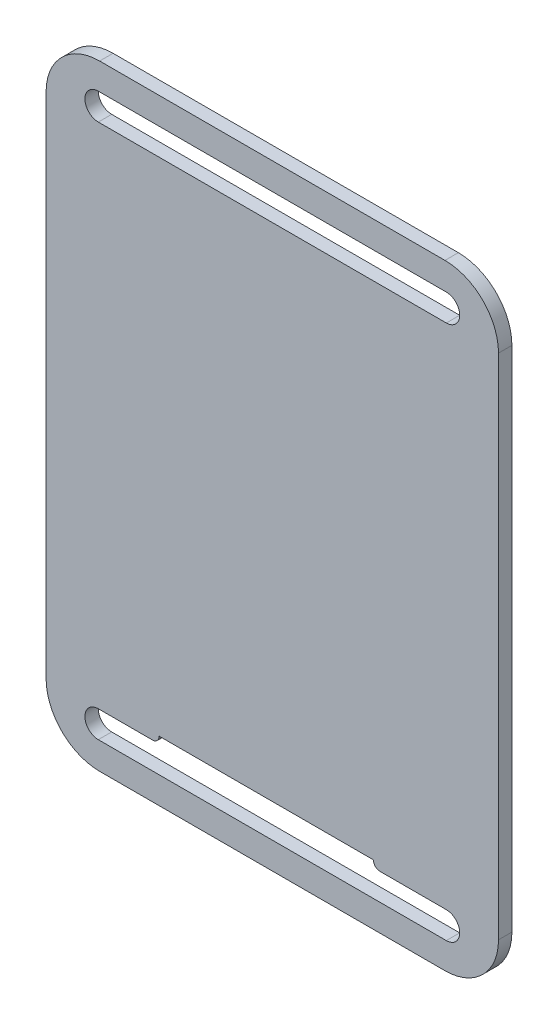
ISO-10303-21;
HEADER;
FILE_DESCRIPTION(('STEP AP214'),'2;1');
FILE_NAME('part.step','',(''),(''),'','','');
FILE_SCHEMA(('AUTOMOTIVE_DESIGN { 1 0 10303 214 1 1 1 1 }'));
ENDSEC;
DATA;
#1=APPLICATION_CONTEXT('core data for automotive mechanical design processes');
#2=APPLICATION_PROTOCOL_DEFINITION('international standard','automotive_design',2000,#1);
#3=PRODUCT_CONTEXT('',#1,'mechanical');
#4=PRODUCT('Part','Part','',(#3));
#5=PRODUCT_RELATED_PRODUCT_CATEGORY('part','',(#4));
#6=PRODUCT_DEFINITION_FORMATION('','',#4);
#7=PRODUCT_DEFINITION_CONTEXT('part definition',#1,'design');
#8=PRODUCT_DEFINITION('design','',#6,#7);
#9=PRODUCT_DEFINITION_SHAPE('','',#8);
#10=(LENGTH_UNIT() NAMED_UNIT(*) SI_UNIT(.MILLI.,.METRE.));
#11=(NAMED_UNIT(*) PLANE_ANGLE_UNIT() SI_UNIT($,.RADIAN.));
#12=(NAMED_UNIT(*) SI_UNIT($,.STERADIAN.) SOLID_ANGLE_UNIT());
#13=UNCERTAINTY_MEASURE_WITH_UNIT(LENGTH_MEASURE(1.E-05),#10,'distance_accuracy_value','');
#14=(GEOMETRIC_REPRESENTATION_CONTEXT(3) GLOBAL_UNCERTAINTY_ASSIGNED_CONTEXT((#13)) GLOBAL_UNIT_ASSIGNED_CONTEXT((#10,
#11,#12)) REPRESENTATION_CONTEXT('',''));
#15=CARTESIAN_POINT('',(0.,0.,0.));
#16=DIRECTION('',(0.,0.,1.));
#17=DIRECTION('',(1.,0.,0.));
#18=AXIS2_PLACEMENT_3D('',#15,#16,#17);
#19=CARTESIAN_POINT('',(4.,41.96,1.6));
#20=DIRECTION('',(0.,0.,-1.));
#21=DIRECTION('',(-1.,0.,0.));
#22=AXIS2_PLACEMENT_3D('',#19,#20,#21);
#23=CYLINDRICAL_SURFACE('',#22,4.);
#24=CARTESIAN_POINT('',(4.,41.96,0.6));
#25=DIRECTION('',(0.,0.,-1.));
#26=DIRECTION('',(-1.,0.,0.));
#27=AXIS2_PLACEMENT_3D('',#24,#25,#26);
#28=CIRCLE('',#27,4.);
#29=CARTESIAN_POINT('',(0.,41.96,0.6));
#30=VERTEX_POINT('',#29);
#31=CARTESIAN_POINT('',(4.,45.96,0.6));
#32=VERTEX_POINT('',#31);
#33=EDGE_CURVE('E292',#30,#32,#28,.T.);
#34=ORIENTED_EDGE('',*,*,#33,.F.);
#35=DIRECTION('',(0.,0.,-1.));
#36=VECTOR('',#35,1.);
#37=CARTESIAN_POINT('',(0.,41.96,1.6));
#38=LINE('',#37,#36);
#39=CARTESIAN_POINT('',(0.,41.96,1.6));
#40=VERTEX_POINT('',#39);
#41=EDGE_CURVE('E11',#40,#30,#38,.T.);
#42=ORIENTED_EDGE('',*,*,#41,.F.);
#43=CARTESIAN_POINT('',(4.,41.96,1.6));
#44=DIRECTION('',(0.,0.,-1.));
#45=DIRECTION('',(-1.,0.,0.));
#46=AXIS2_PLACEMENT_3D('',#43,#44,#45);
#47=CIRCLE('',#46,4.);
#48=CARTESIAN_POINT('',(4.,45.96,1.6));
#49=VERTEX_POINT('',#48);
#50=EDGE_CURVE('E314',#40,#49,#47,.T.);
#51=ORIENTED_EDGE('',*,*,#50,.T.);
#52=DIRECTION('',(0.,0.,-1.));
#53=VECTOR('',#52,1.);
#54=CARTESIAN_POINT('',(4.,45.96,1.6));
#55=LINE('',#54,#53);
#56=EDGE_CURVE('E42',#49,#32,#55,.T.);
#57=ORIENTED_EDGE('',*,*,#56,.T.);
#58=EDGE_LOOP('',(#34,#42,#51,#57));
#59=FACE_BOUND('',#58,.T.);
#60=ADVANCED_FACE('F39',(#59),#23,.T.);
#61=CARTESIAN_POINT('',(0.,4.,1.6));
#62=DIRECTION('',(-1.,0.,0.));
#63=DIRECTION('',(0.,0.,1.));
#64=AXIS2_PLACEMENT_3D('',#61,#62,#63);
#65=PLANE('',#64);
#66=DIRECTION('',(0.,1.,0.));
#67=VECTOR('',#66,1.);
#68=CARTESIAN_POINT('',(0.,4.,0.6));
#69=LINE('',#68,#67);
#70=CARTESIAN_POINT('',(0.,4.,0.6));
#71=VERTEX_POINT('',#70);
#72=EDGE_CURVE('E319',#71,#30,#69,.T.);
#73=ORIENTED_EDGE('',*,*,#72,.F.);
#74=DIRECTION('',(0.,0.,-1.));
#75=VECTOR('',#74,1.);
#76=CARTESIAN_POINT('',(0.,4.,1.6));
#77=LINE('',#76,#75);
#78=CARTESIAN_POINT('',(0.,4.,1.6));
#79=VERTEX_POINT('',#78);
#80=EDGE_CURVE('E48',#79,#71,#77,.T.);
#81=ORIENTED_EDGE('',*,*,#80,.F.);
#82=DIRECTION('',(0.,1.,0.));
#83=VECTOR('',#82,1.);
#84=CARTESIAN_POINT('',(0.,4.,1.6));
#85=LINE('',#84,#83);
#86=EDGE_CURVE('E343',#79,#40,#85,.T.);
#87=ORIENTED_EDGE('',*,*,#86,.T.);
#88=ORIENTED_EDGE('',*,*,#41,.T.);
#89=EDGE_LOOP('',(#73,#81,#87,#88));
#90=FACE_BOUND('',#89,.T.);
#91=ADVANCED_FACE('F406',(#90),#65,.T.);
#92=CARTESIAN_POINT('',(4.,4.,1.6));
#93=DIRECTION('',(0.,0.,-1.));
#94=DIRECTION('',(-1.,0.,0.));
#95=AXIS2_PLACEMENT_3D('',#92,#93,#94);
#96=CYLINDRICAL_SURFACE('',#95,4.);
#97=CARTESIAN_POINT('',(4.,4.,0.6));
#98=DIRECTION('',(0.,0.,-1.));
#99=DIRECTION('',(-1.,0.,0.));
#100=AXIS2_PLACEMENT_3D('',#97,#98,#99);
#101=CIRCLE('',#100,4.);
#102=CARTESIAN_POINT('',(4.,0.,0.6));
#103=VERTEX_POINT('',#102);
#104=EDGE_CURVE('E370',#103,#71,#101,.T.);
#105=ORIENTED_EDGE('',*,*,#104,.F.);
#106=DIRECTION('',(0.,0.,-1.));
#107=VECTOR('',#106,1.);
#108=CARTESIAN_POINT('',(4.,0.,1.6));
#109=LINE('',#108,#107);
#110=CARTESIAN_POINT('',(4.,0.,1.6));
#111=VERTEX_POINT('',#110);
#112=EDGE_CURVE('E379',#111,#103,#109,.T.);
#113=ORIENTED_EDGE('',*,*,#112,.F.);
#114=CARTESIAN_POINT('',(4.,4.,1.6));
#115=DIRECTION('',(0.,0.,-1.));
#116=DIRECTION('',(-1.,0.,0.));
#117=AXIS2_PLACEMENT_3D('',#114,#115,#116);
#118=CIRCLE('',#117,4.);
#119=EDGE_CURVE('E339',#111,#79,#118,.T.);
#120=ORIENTED_EDGE('',*,*,#119,.T.);
#121=ORIENTED_EDGE('',*,*,#80,.T.);
#122=EDGE_LOOP('',(#105,#113,#120,#121));
#123=FACE_BOUND('',#122,.T.);
#124=ADVANCED_FACE('F426',(#123),#96,.T.);
#125=CARTESIAN_POINT('',(29.8,0.,1.6));
#126=DIRECTION('',(0.,-1.,0.));
#127=DIRECTION('',(0.,0.,-1.));
#128=AXIS2_PLACEMENT_3D('',#125,#126,#127);
#129=PLANE('',#128);
#130=DIRECTION('',(-1.,0.,0.));
#131=VECTOR('',#130,1.);
#132=CARTESIAN_POINT('',(29.8,0.,0.6));
#133=LINE('',#132,#131);
#134=CARTESIAN_POINT('',(29.8,0.,0.6));
#135=VERTEX_POINT('',#134);
#136=EDGE_CURVE('E366',#135,#103,#133,.T.);
#137=ORIENTED_EDGE('',*,*,#136,.F.);
#138=DIRECTION('',(0.,0.,-1.));
#139=VECTOR('',#138,1.);
#140=CARTESIAN_POINT('',(29.8,0.,1.6));
#141=LINE('',#140,#139);
#142=CARTESIAN_POINT('',(29.8,0.,1.6));
#143=VERTEX_POINT('',#142);
#144=EDGE_CURVE('E382',#143,#135,#141,.T.);
#145=ORIENTED_EDGE('',*,*,#144,.F.);
#146=DIRECTION('',(-1.,0.,0.));
#147=VECTOR('',#146,1.);
#148=CARTESIAN_POINT('',(29.8,0.,1.6));
#149=LINE('',#148,#147);
#150=EDGE_CURVE('E335',#143,#111,#149,.T.);
#151=ORIENTED_EDGE('',*,*,#150,.T.);
#152=ORIENTED_EDGE('',*,*,#112,.T.);
#153=EDGE_LOOP('',(#137,#145,#151,#152));
#154=FACE_BOUND('',#153,.T.);
#155=ADVANCED_FACE('F424',(#154),#129,.T.);
#156=CARTESIAN_POINT('',(29.8,4.,1.6));
#157=DIRECTION('',(0.,0.,-1.));
#158=DIRECTION('',(-1.,0.,0.));
#159=AXIS2_PLACEMENT_3D('',#156,#157,#158);
#160=CYLINDRICAL_SURFACE('',#159,4.);
#161=CARTESIAN_POINT('',(29.8,4.,0.6));
#162=DIRECTION('',(0.,0.,-1.));
#163=DIRECTION('',(-1.,0.,0.));
#164=AXIS2_PLACEMENT_3D('',#161,#162,#163);
#165=CIRCLE('',#164,4.);
#166=CARTESIAN_POINT('',(33.8,4.,0.6));
#167=VERTEX_POINT('',#166);
#168=EDGE_CURVE('E362',#167,#135,#165,.T.);
#169=ORIENTED_EDGE('',*,*,#168,.F.);
#170=DIRECTION('',(0.,0.,-1.));
#171=VECTOR('',#170,1.);
#172=CARTESIAN_POINT('',(33.8,4.,1.6));
#173=LINE('',#172,#171);
#174=CARTESIAN_POINT('',(33.8,4.,1.6));
#175=VERTEX_POINT('',#174);
#176=EDGE_CURVE('E385',#175,#167,#173,.T.);
#177=ORIENTED_EDGE('',*,*,#176,.F.);
#178=CARTESIAN_POINT('',(29.8,4.,1.6));
#179=DIRECTION('',(0.,0.,-1.));
#180=DIRECTION('',(-1.,0.,0.));
#181=AXIS2_PLACEMENT_3D('',#178,#179,#180);
#182=CIRCLE('',#181,4.);
#183=EDGE_CURVE('E331',#175,#143,#182,.T.);
#184=ORIENTED_EDGE('',*,*,#183,.T.);
#185=ORIENTED_EDGE('',*,*,#144,.T.);
#186=EDGE_LOOP('',(#169,#177,#184,#185));
#187=FACE_BOUND('',#186,.T.);
#188=ADVANCED_FACE('F420',(#187),#160,.T.);
#189=CARTESIAN_POINT('',(33.8,41.96,1.6));
#190=DIRECTION('',(1.,0.,0.));
#191=DIRECTION('',(0.,0.,-1.));
#192=AXIS2_PLACEMENT_3D('',#189,#190,#191);
#193=PLANE('',#192);
#194=DIRECTION('',(0.,-1.,0.));
#195=VECTOR('',#194,1.);
#196=CARTESIAN_POINT('',(33.8,41.96,0.6));
#197=LINE('',#196,#195);
#198=CARTESIAN_POINT('',(33.8,41.96,0.6));
#199=VERTEX_POINT('',#198);
#200=EDGE_CURVE('E358',#199,#167,#197,.T.);
#201=ORIENTED_EDGE('',*,*,#200,.F.);
#202=DIRECTION('',(0.,0.,-1.));
#203=VECTOR('',#202,1.);
#204=CARTESIAN_POINT('',(33.8,41.96,1.6));
#205=LINE('',#204,#203);
#206=CARTESIAN_POINT('',(33.8,41.96,1.6));
#207=VERTEX_POINT('',#206);
#208=EDGE_CURVE('E388',#207,#199,#205,.T.);
#209=ORIENTED_EDGE('',*,*,#208,.F.);
#210=DIRECTION('',(0.,-1.,0.));
#211=VECTOR('',#210,1.);
#212=CARTESIAN_POINT('',(33.8,41.96,1.6));
#213=LINE('',#212,#211);
#214=EDGE_CURVE('E327',#207,#175,#213,.T.);
#215=ORIENTED_EDGE('',*,*,#214,.T.);
#216=ORIENTED_EDGE('',*,*,#176,.T.);
#217=EDGE_LOOP('',(#201,#209,#215,#216));
#218=FACE_BOUND('',#217,.T.);
#219=ADVANCED_FACE('F418',(#218),#193,.T.);
#220=CARTESIAN_POINT('',(29.8,41.96,1.6));
#221=DIRECTION('',(0.,0.,-1.));
#222=DIRECTION('',(-1.,0.,0.));
#223=AXIS2_PLACEMENT_3D('',#220,#221,#222);
#224=CYLINDRICAL_SURFACE('',#223,4.);
#225=CARTESIAN_POINT('',(29.8,41.96,0.6));
#226=DIRECTION('',(0.,0.,-1.));
#227=DIRECTION('',(-1.,0.,0.));
#228=AXIS2_PLACEMENT_3D('',#225,#226,#227);
#229=CIRCLE('',#228,4.);
#230=CARTESIAN_POINT('',(29.8,45.96,0.6));
#231=VERTEX_POINT('',#230);
#232=EDGE_CURVE('E354',#231,#199,#229,.T.);
#233=ORIENTED_EDGE('',*,*,#232,.F.);
#234=DIRECTION('',(0.,0.,-1.));
#235=VECTOR('',#234,1.);
#236=CARTESIAN_POINT('',(29.8,45.96,1.6));
#237=LINE('',#236,#235);
#238=CARTESIAN_POINT('',(29.8,45.96,1.6));
#239=VERTEX_POINT('',#238);
#240=EDGE_CURVE('E390',#239,#231,#237,.T.);
#241=ORIENTED_EDGE('',*,*,#240,.F.);
#242=CARTESIAN_POINT('',(29.8,41.96,1.6));
#243=DIRECTION('',(0.,0.,-1.));
#244=DIRECTION('',(-1.,0.,0.));
#245=AXIS2_PLACEMENT_3D('',#242,#243,#244);
#246=CIRCLE('',#245,4.);
#247=EDGE_CURVE('E323',#239,#207,#246,.T.);
#248=ORIENTED_EDGE('',*,*,#247,.T.);
#249=ORIENTED_EDGE('',*,*,#208,.T.);
#250=EDGE_LOOP('',(#233,#241,#248,#249));
#251=FACE_BOUND('',#250,.T.);
#252=ADVANCED_FACE('F414',(#251),#224,.T.);
#253=CARTESIAN_POINT('',(4.,45.96,1.6));
#254=DIRECTION('',(0.,1.,0.));
#255=DIRECTION('',(0.,0.,1.));
#256=AXIS2_PLACEMENT_3D('',#253,#254,#255);
#257=PLANE('',#256);
#258=DIRECTION('',(1.,0.,0.));
#259=VECTOR('',#258,1.);
#260=CARTESIAN_POINT('',(4.,45.96,0.6));
#261=LINE('',#260,#259);
#262=EDGE_CURVE('E350',#32,#231,#261,.T.);
#263=ORIENTED_EDGE('',*,*,#262,.F.);
#264=ORIENTED_EDGE('',*,*,#56,.F.);
#265=DIRECTION('',(1.,0.,0.));
#266=VECTOR('',#265,1.);
#267=CARTESIAN_POINT('',(4.,45.96,1.6));
#268=LINE('',#267,#266);
#269=EDGE_CURVE('E318',#49,#239,#268,.T.);
#270=ORIENTED_EDGE('',*,*,#269,.T.);
#271=ORIENTED_EDGE('',*,*,#240,.T.);
#272=EDGE_LOOP('',(#263,#264,#270,#271));
#273=FACE_BOUND('',#272,.T.);
#274=ADVANCED_FACE('F400',(#273),#257,.T.);
#275=CARTESIAN_POINT('',(4.,41.96,1.6));
#276=DIRECTION('',(0.,0.,-1.));
#277=DIRECTION('',(-1.,0.,0.));
#278=AXIS2_PLACEMENT_3D('',#275,#276,#277);
#279=PLANE('',#278);
#280=DIRECTION('',(-1.,0.,0.));
#281=VECTOR('',#280,1.);
#282=CARTESIAN_POINT('',(3.9,41.96,1.6));
#283=LINE('',#282,#281);
#284=CARTESIAN_POINT('',(29.9,41.96,1.6));
#285=VERTEX_POINT('',#284);
#286=CARTESIAN_POINT('',(3.9,41.96,1.6));
#287=VERTEX_POINT('',#286);
#288=EDGE_CURVE('E186',#285,#287,#283,.T.);
#289=ORIENTED_EDGE('',*,*,#288,.T.);
#290=CARTESIAN_POINT('',(3.9,42.96,1.6));
#291=DIRECTION('',(0.,0.,-1.));
#292=DIRECTION('',(1.,0.,0.));
#293=AXIS2_PLACEMENT_3D('',#290,#291,#292);
#294=CIRCLE('',#293,1.);
#295=CARTESIAN_POINT('',(3.9,43.96,1.6));
#296=VERTEX_POINT('',#295);
#297=EDGE_CURVE('E179',#287,#296,#294,.T.);
#298=ORIENTED_EDGE('',*,*,#297,.T.);
#299=DIRECTION('',(1.,0.,0.));
#300=VECTOR('',#299,1.);
#301=CARTESIAN_POINT('',(29.9,43.96,1.6));
#302=LINE('',#301,#300);
#303=CARTESIAN_POINT('',(29.9,43.96,1.6));
#304=VERTEX_POINT('',#303);
#305=EDGE_CURVE('E189',#296,#304,#302,.T.);
#306=ORIENTED_EDGE('',*,*,#305,.T.);
#307=CARTESIAN_POINT('',(29.9,42.96,1.6));
#308=DIRECTION('',(0.,0.,-1.));
#309=DIRECTION('',(1.,0.,0.));
#310=AXIS2_PLACEMENT_3D('',#307,#308,#309);
#311=CIRCLE('',#310,1.);
#312=EDGE_CURVE('E56',#304,#285,#311,.T.);
#313=ORIENTED_EDGE('',*,*,#312,.T.);
#314=EDGE_LOOP('',(#289,#298,#306,#313));
#315=FACE_BOUND('',#314,.T.);
#316=DIRECTION('',(1.,0.,0.));
#317=VECTOR('',#316,1.);
#318=CARTESIAN_POINT('',(7.95,4.,1.6));
#319=LINE('',#318,#317);
#320=CARTESIAN_POINT('',(3.9,4.,1.6));
#321=VERTEX_POINT('',#320);
#322=CARTESIAN_POINT('',(7.95,4.,1.6));
#323=VERTEX_POINT('',#322);
#324=EDGE_CURVE('E255',#321,#323,#319,.T.);
#325=ORIENTED_EDGE('',*,*,#324,.T.);
#326=CARTESIAN_POINT('',(7.95,4.5,1.6));
#327=DIRECTION('',(0.,0.,1.));
#328=DIRECTION('',(-1.,0.,0.));
#329=AXIS2_PLACEMENT_3D('',#326,#327,#328);
#330=CIRCLE('',#329,0.5);
#331=CARTESIAN_POINT('',(8.45,4.5,1.6));
#332=VERTEX_POINT('',#331);
#333=EDGE_CURVE('E226',#323,#332,#330,.T.);
#334=ORIENTED_EDGE('',*,*,#333,.T.);
#335=DIRECTION('',(1.,0.,0.));
#336=VECTOR('',#335,1.);
#337=CARTESIAN_POINT('',(24.45,4.5,1.6));
#338=LINE('',#337,#336);
#339=CARTESIAN_POINT('',(24.45,4.5,1.6));
#340=VERTEX_POINT('',#339);
#341=EDGE_CURVE('E230',#332,#340,#338,.T.);
#342=ORIENTED_EDGE('',*,*,#341,.T.);
#343=CARTESIAN_POINT('',(24.95,4.5,1.6));
#344=DIRECTION('',(0.,0.,1.));
#345=DIRECTION('',(-1.,0.,0.));
#346=AXIS2_PLACEMENT_3D('',#343,#344,#345);
#347=CIRCLE('',#346,0.500000000000001);
#348=CARTESIAN_POINT('',(24.95,4.,1.6));
#349=VERTEX_POINT('',#348);
#350=EDGE_CURVE('E235',#340,#349,#347,.T.);
#351=ORIENTED_EDGE('',*,*,#350,.T.);
#352=DIRECTION('',(1.,0.,0.));
#353=VECTOR('',#352,1.);
#354=CARTESIAN_POINT('',(29.9,4.,1.6));
#355=LINE('',#354,#353);
#356=CARTESIAN_POINT('',(29.9,4.,1.6));
#357=VERTEX_POINT('',#356);
#358=EDGE_CURVE('E239',#349,#357,#355,.T.);
#359=ORIENTED_EDGE('',*,*,#358,.T.);
#360=CARTESIAN_POINT('',(29.9,3.,1.6));
#361=DIRECTION('',(0.,0.,-1.));
#362=DIRECTION('',(1.,0.,0.));
#363=AXIS2_PLACEMENT_3D('',#360,#361,#362);
#364=CIRCLE('',#363,1.);
#365=CARTESIAN_POINT('',(29.9,2.,1.6));
#366=VERTEX_POINT('',#365);
#367=EDGE_CURVE('E243',#357,#366,#364,.T.);
#368=ORIENTED_EDGE('',*,*,#367,.T.);
#369=DIRECTION('',(-1.,0.,0.));
#370=VECTOR('',#369,1.);
#371=CARTESIAN_POINT('',(3.9,2.,1.6));
#372=LINE('',#371,#370);
#373=CARTESIAN_POINT('',(3.9,2.,1.6));
#374=VERTEX_POINT('',#373);
#375=EDGE_CURVE('E247',#366,#374,#372,.T.);
#376=ORIENTED_EDGE('',*,*,#375,.T.);
#377=CARTESIAN_POINT('',(3.9,3.,1.6));
#378=DIRECTION('',(0.,0.,-1.));
#379=DIRECTION('',(1.,0.,0.));
#380=AXIS2_PLACEMENT_3D('',#377,#378,#379);
#381=CIRCLE('',#380,1.);
#382=EDGE_CURVE('E251',#374,#321,#381,.T.);
#383=ORIENTED_EDGE('',*,*,#382,.T.);
#384=EDGE_LOOP('',(#325,#334,#342,#351,#359,#368,#376,#383));
#385=FACE_BOUND('',#384,.T.);
#386=ORIENTED_EDGE('',*,*,#50,.F.);
#387=ORIENTED_EDGE('',*,*,#86,.F.);
#388=ORIENTED_EDGE('',*,*,#119,.F.);
#389=ORIENTED_EDGE('',*,*,#150,.F.);
#390=ORIENTED_EDGE('',*,*,#183,.F.);
#391=ORIENTED_EDGE('',*,*,#214,.F.);
#392=ORIENTED_EDGE('',*,*,#247,.F.);
#393=ORIENTED_EDGE('',*,*,#269,.F.);
#394=EDGE_LOOP('',(#386,#387,#388,#389,#390,#391,#392,#393));
#395=FACE_BOUND('',#394,.T.);
#396=ADVANCED_FACE('F194',(#315,#385,#395),#279,.F.);
#397=CARTESIAN_POINT('',(4.,41.96,0.6));
#398=DIRECTION('',(0.,0.,-1.));
#399=DIRECTION('',(-1.,0.,0.));
#400=AXIS2_PLACEMENT_3D('',#397,#398,#399);
#401=PLANE('',#400);
#402=CARTESIAN_POINT('',(3.9,42.96,0.6));
#403=DIRECTION('',(0.,0.,-1.));
#404=DIRECTION('',(1.,0.,0.));
#405=AXIS2_PLACEMENT_3D('',#402,#403,#404);
#406=CIRCLE('',#405,1.);
#407=CARTESIAN_POINT('',(3.9,41.96,0.6));
#408=VERTEX_POINT('',#407);
#409=CARTESIAN_POINT('',(3.9,43.96,0.6));
#410=VERTEX_POINT('',#409);
#411=EDGE_CURVE('E64',#408,#410,#406,.T.);
#412=ORIENTED_EDGE('',*,*,#411,.F.);
#413=DIRECTION('',(-1.,0.,0.));
#414=VECTOR('',#413,1.);
#415=CARTESIAN_POINT('',(3.9,41.96,0.6));
#416=LINE('',#415,#414);
#417=CARTESIAN_POINT('',(29.9,41.96,0.6));
#418=VERTEX_POINT('',#417);
#419=EDGE_CURVE('E198',#418,#408,#416,.T.);
#420=ORIENTED_EDGE('',*,*,#419,.F.);
#421=CARTESIAN_POINT('',(29.9,42.96,0.6));
#422=DIRECTION('',(0.,0.,-1.));
#423=DIRECTION('',(1.,0.,0.));
#424=AXIS2_PLACEMENT_3D('',#421,#422,#423);
#425=CIRCLE('',#424,1.);
#426=CARTESIAN_POINT('',(29.9,43.96,0.6));
#427=VERTEX_POINT('',#426);
#428=EDGE_CURVE('E202',#427,#418,#425,.T.);
#429=ORIENTED_EDGE('',*,*,#428,.F.);
#430=DIRECTION('',(1.,0.,0.));
#431=VECTOR('',#430,1.);
#432=CARTESIAN_POINT('',(29.9,43.96,0.6));
#433=LINE('',#432,#431);
#434=EDGE_CURVE('E211',#410,#427,#433,.T.);
#435=ORIENTED_EDGE('',*,*,#434,.F.);
#436=EDGE_LOOP('',(#412,#420,#429,#435));
#437=FACE_BOUND('',#436,.T.);
#438=CARTESIAN_POINT('',(7.95,4.5,0.6));
#439=DIRECTION('',(0.,0.,1.));
#440=DIRECTION('',(-1.,0.,0.));
#441=AXIS2_PLACEMENT_3D('',#438,#439,#440);
#442=CIRCLE('',#441,0.5);
#443=CARTESIAN_POINT('',(7.95,4.,0.6));
#444=VERTEX_POINT('',#443);
#445=CARTESIAN_POINT('',(8.45,4.5,0.6));
#446=VERTEX_POINT('',#445);
#447=EDGE_CURVE('E220',#444,#446,#442,.T.);
#448=ORIENTED_EDGE('',*,*,#447,.F.);
#449=DIRECTION('',(1.,0.,0.));
#450=VECTOR('',#449,1.);
#451=CARTESIAN_POINT('',(7.95,4.,0.6));
#452=LINE('',#451,#450);
#453=CARTESIAN_POINT('',(3.9,4.,0.6));
#454=VERTEX_POINT('',#453);
#455=EDGE_CURVE('E231',#454,#444,#452,.T.);
#456=ORIENTED_EDGE('',*,*,#455,.F.);
#457=CARTESIAN_POINT('',(3.9,3.,0.6));
#458=DIRECTION('',(0.,0.,-1.));
#459=DIRECTION('',(1.,0.,0.));
#460=AXIS2_PLACEMENT_3D('',#457,#458,#459);
#461=CIRCLE('',#460,1.);
#462=CARTESIAN_POINT('',(3.9,2.,0.6));
#463=VERTEX_POINT('',#462);
#464=EDGE_CURVE('E282',#463,#454,#461,.T.);
#465=ORIENTED_EDGE('',*,*,#464,.F.);
#466=DIRECTION('',(-1.,0.,0.));
#467=VECTOR('',#466,1.);
#468=CARTESIAN_POINT('',(3.9,2.,0.6));
#469=LINE('',#468,#467);
#470=CARTESIAN_POINT('',(29.9,2.,0.6));
#471=VERTEX_POINT('',#470);
#472=EDGE_CURVE('E278',#471,#463,#469,.T.);
#473=ORIENTED_EDGE('',*,*,#472,.F.);
#474=CARTESIAN_POINT('',(29.9,3.,0.6));
#475=DIRECTION('',(0.,0.,-1.));
#476=DIRECTION('',(1.,0.,0.));
#477=AXIS2_PLACEMENT_3D('',#474,#475,#476);
#478=CIRCLE('',#477,1.);
#479=CARTESIAN_POINT('',(29.9,4.,0.6));
#480=VERTEX_POINT('',#479);
#481=EDGE_CURVE('E274',#480,#471,#478,.T.);
#482=ORIENTED_EDGE('',*,*,#481,.F.);
#483=DIRECTION('',(1.,0.,0.));
#484=VECTOR('',#483,1.);
#485=CARTESIAN_POINT('',(29.9,4.,0.6));
#486=LINE('',#485,#484);
#487=CARTESIAN_POINT('',(24.95,4.,0.6));
#488=VERTEX_POINT('',#487);
#489=EDGE_CURVE('E270',#488,#480,#486,.T.);
#490=ORIENTED_EDGE('',*,*,#489,.F.);
#491=CARTESIAN_POINT('',(24.95,4.5,0.6));
#492=DIRECTION('',(0.,0.,1.));
#493=DIRECTION('',(-1.,0.,0.));
#494=AXIS2_PLACEMENT_3D('',#491,#492,#493);
#495=CIRCLE('',#494,0.500000000000001);
#496=CARTESIAN_POINT('',(24.45,4.5,0.6));
#497=VERTEX_POINT('',#496);
#498=EDGE_CURVE('E266',#497,#488,#495,.T.);
#499=ORIENTED_EDGE('',*,*,#498,.F.);
#500=DIRECTION('',(1.,0.,0.));
#501=VECTOR('',#500,1.);
#502=CARTESIAN_POINT('',(24.45,4.5,0.6));
#503=LINE('',#502,#501);
#504=EDGE_CURVE('E262',#446,#497,#503,.T.);
#505=ORIENTED_EDGE('',*,*,#504,.F.);
#506=EDGE_LOOP('',(#448,#456,#465,#473,#482,#490,#499,#505));
#507=FACE_BOUND('',#506,.T.);
#508=ORIENTED_EDGE('',*,*,#33,.T.);
#509=ORIENTED_EDGE('',*,*,#262,.T.);
#510=ORIENTED_EDGE('',*,*,#232,.T.);
#511=ORIENTED_EDGE('',*,*,#200,.T.);
#512=ORIENTED_EDGE('',*,*,#168,.T.);
#513=ORIENTED_EDGE('',*,*,#136,.T.);
#514=ORIENTED_EDGE('',*,*,#104,.T.);
#515=ORIENTED_EDGE('',*,*,#72,.T.);
#516=EDGE_LOOP('',(#508,#509,#510,#511,#512,#513,#514,#515));
#517=FACE_BOUND('',#516,.T.);
#518=ADVANCED_FACE('F402',(#437,#507,#517),#401,.T.);
#519=CARTESIAN_POINT('',(7.95,4.5,1.6));
#520=DIRECTION('',(0.,0.,-1.));
#521=DIRECTION('',(-1.,0.,0.));
#522=AXIS2_PLACEMENT_3D('',#519,#520,#521);
#523=CYLINDRICAL_SURFACE('',#522,0.5);
#524=ORIENTED_EDGE('',*,*,#447,.T.);
#525=DIRECTION('',(0.,0.,-1.));
#526=VECTOR('',#525,1.);
#527=CARTESIAN_POINT('',(8.45,4.5,1.6));
#528=LINE('',#527,#526);
#529=EDGE_CURVE('E259',#332,#446,#528,.T.);
#530=ORIENTED_EDGE('',*,*,#529,.F.);
#531=ORIENTED_EDGE('',*,*,#333,.F.);
#532=DIRECTION('',(0.,0.,-1.));
#533=VECTOR('',#532,1.);
#534=CARTESIAN_POINT('',(7.95,4.,1.6));
#535=LINE('',#534,#533);
#536=EDGE_CURVE('E289',#323,#444,#535,.T.);
#537=ORIENTED_EDGE('',*,*,#536,.T.);
#538=EDGE_LOOP('',(#524,#530,#531,#537));
#539=FACE_BOUND('',#538,.T.);
#540=ADVANCED_FACE('F500',(#539),#523,.T.);
#541=CARTESIAN_POINT('',(7.95,4.,1.6));
#542=DIRECTION('',(0.,1.,0.));
#543=DIRECTION('',(0.,0.,1.));
#544=AXIS2_PLACEMENT_3D('',#541,#542,#543);
#545=PLANE('',#544);
#546=ORIENTED_EDGE('',*,*,#455,.T.);
#547=ORIENTED_EDGE('',*,*,#536,.F.);
#548=ORIENTED_EDGE('',*,*,#324,.F.);
#549=DIRECTION('',(0.,0.,-1.));
#550=VECTOR('',#549,1.);
#551=CARTESIAN_POINT('',(3.9,4.,1.6));
#552=LINE('',#551,#550);
#553=EDGE_CURVE('E293',#321,#454,#552,.T.);
#554=ORIENTED_EDGE('',*,*,#553,.T.);
#555=EDGE_LOOP('',(#546,#547,#548,#554));
#556=FACE_BOUND('',#555,.T.);
#557=ADVANCED_FACE('F510',(#556),#545,.F.);
#558=CARTESIAN_POINT('',(3.9,3.,1.6));
#559=DIRECTION('',(0.,0.,-1.));
#560=DIRECTION('',(-1.,0.,0.));
#561=AXIS2_PLACEMENT_3D('',#558,#559,#560);
#562=CYLINDRICAL_SURFACE('',#561,1.);
#563=ORIENTED_EDGE('',*,*,#464,.T.);
#564=ORIENTED_EDGE('',*,*,#553,.F.);
#565=ORIENTED_EDGE('',*,*,#382,.F.);
#566=DIRECTION('',(0.,0.,-1.));
#567=VECTOR('',#566,1.);
#568=CARTESIAN_POINT('',(3.9,2.,1.6));
#569=LINE('',#568,#567);
#570=EDGE_CURVE('E296',#374,#463,#569,.T.);
#571=ORIENTED_EDGE('',*,*,#570,.T.);
#572=EDGE_LOOP('',(#563,#564,#565,#571));
#573=FACE_BOUND('',#572,.T.);
#574=ADVANCED_FACE('F520',(#573),#562,.F.);
#575=CARTESIAN_POINT('',(3.9,2.,1.6));
#576=DIRECTION('',(0.,-1.,0.));
#577=DIRECTION('',(0.,0.,-1.));
#578=AXIS2_PLACEMENT_3D('',#575,#576,#577);
#579=PLANE('',#578);
#580=ORIENTED_EDGE('',*,*,#472,.T.);
#581=ORIENTED_EDGE('',*,*,#570,.F.);
#582=ORIENTED_EDGE('',*,*,#375,.F.);
#583=DIRECTION('',(0.,0.,-1.));
#584=VECTOR('',#583,1.);
#585=CARTESIAN_POINT('',(29.9,2.,1.6));
#586=LINE('',#585,#584);
#587=EDGE_CURVE('E299',#366,#471,#586,.T.);
#588=ORIENTED_EDGE('',*,*,#587,.T.);
#589=EDGE_LOOP('',(#580,#581,#582,#588));
#590=FACE_BOUND('',#589,.T.);
#591=ADVANCED_FACE('F530',(#590),#579,.F.);
#592=CARTESIAN_POINT('',(29.9,3.,1.6));
#593=DIRECTION('',(0.,0.,-1.));
#594=DIRECTION('',(-1.,0.,0.));
#595=AXIS2_PLACEMENT_3D('',#592,#593,#594);
#596=CYLINDRICAL_SURFACE('',#595,1.);
#597=ORIENTED_EDGE('',*,*,#481,.T.);
#598=ORIENTED_EDGE('',*,*,#587,.F.);
#599=ORIENTED_EDGE('',*,*,#367,.F.);
#600=DIRECTION('',(0.,0.,-1.));
#601=VECTOR('',#600,1.);
#602=CARTESIAN_POINT('',(29.9,4.,1.6));
#603=LINE('',#602,#601);
#604=EDGE_CURVE('E302',#357,#480,#603,.T.);
#605=ORIENTED_EDGE('',*,*,#604,.T.);
#606=EDGE_LOOP('',(#597,#598,#599,#605));
#607=FACE_BOUND('',#606,.T.);
#608=ADVANCED_FACE('F540',(#607),#596,.F.);
#609=CARTESIAN_POINT('',(29.9,4.,1.6));
#610=DIRECTION('',(0.,1.,0.));
#611=DIRECTION('',(-1.,0.,0.));
#612=AXIS2_PLACEMENT_3D('',#609,#610,#611);
#613=PLANE('',#612);
#614=ORIENTED_EDGE('',*,*,#489,.T.);
#615=ORIENTED_EDGE('',*,*,#604,.F.);
#616=ORIENTED_EDGE('',*,*,#358,.F.);
#617=DIRECTION('',(0.,0.,-1.));
#618=VECTOR('',#617,1.);
#619=CARTESIAN_POINT('',(24.95,4.,1.6));
#620=LINE('',#619,#618);
#621=EDGE_CURVE('E305',#349,#488,#620,.T.);
#622=ORIENTED_EDGE('',*,*,#621,.T.);
#623=EDGE_LOOP('',(#614,#615,#616,#622));
#624=FACE_BOUND('',#623,.T.);
#625=ADVANCED_FACE('F550',(#624),#613,.F.);
#626=CARTESIAN_POINT('',(24.95,4.5,1.6));
#627=DIRECTION('',(0.,0.,-1.));
#628=DIRECTION('',(-1.,0.,0.));
#629=AXIS2_PLACEMENT_3D('',#626,#627,#628);
#630=CYLINDRICAL_SURFACE('',#629,0.500000000000001);
#631=ORIENTED_EDGE('',*,*,#498,.T.);
#632=ORIENTED_EDGE('',*,*,#621,.F.);
#633=ORIENTED_EDGE('',*,*,#350,.F.);
#634=DIRECTION('',(0.,0.,-1.));
#635=VECTOR('',#634,1.);
#636=CARTESIAN_POINT('',(24.45,4.5,1.6));
#637=LINE('',#636,#635);
#638=EDGE_CURVE('E308',#340,#497,#637,.T.);
#639=ORIENTED_EDGE('',*,*,#638,.T.);
#640=EDGE_LOOP('',(#631,#632,#633,#639));
#641=FACE_BOUND('',#640,.T.);
#642=ADVANCED_FACE('F560',(#641),#630,.T.);
#643=CARTESIAN_POINT('',(24.45,4.5,1.6));
#644=DIRECTION('',(0.,1.,0.));
#645=DIRECTION('',(0.,0.,1.));
#646=AXIS2_PLACEMENT_3D('',#643,#644,#645);
#647=PLANE('',#646);
#648=ORIENTED_EDGE('',*,*,#504,.T.);
#649=ORIENTED_EDGE('',*,*,#638,.F.);
#650=ORIENTED_EDGE('',*,*,#341,.F.);
#651=ORIENTED_EDGE('',*,*,#529,.T.);
#652=EDGE_LOOP('',(#648,#649,#650,#651));
#653=FACE_BOUND('',#652,.T.);
#654=ADVANCED_FACE('F570',(#653),#647,.F.);
#655=CARTESIAN_POINT('',(3.9,42.96,1.6));
#656=DIRECTION('',(0.,0.,-1.));
#657=DIRECTION('',(-1.,0.,0.));
#658=AXIS2_PLACEMENT_3D('',#655,#656,#657);
#659=CYLINDRICAL_SURFACE('',#658,1.);
#660=ORIENTED_EDGE('',*,*,#411,.T.);
#661=DIRECTION('',(0.,0.,-1.));
#662=VECTOR('',#661,1.);
#663=CARTESIAN_POINT('',(3.9,43.96,1.6));
#664=LINE('',#663,#662);
#665=EDGE_CURVE('E175',#296,#410,#664,.T.);
#666=ORIENTED_EDGE('',*,*,#665,.F.);
#667=ORIENTED_EDGE('',*,*,#297,.F.);
#668=DIRECTION('',(0.,0.,-1.));
#669=VECTOR('',#668,1.);
#670=CARTESIAN_POINT('',(3.9,41.96,1.6));
#671=LINE('',#670,#669);
#672=EDGE_CURVE('E217',#287,#408,#671,.T.);
#673=ORIENTED_EDGE('',*,*,#672,.T.);
#674=EDGE_LOOP('',(#660,#666,#667,#673));
#675=FACE_BOUND('',#674,.T.);
#676=ADVANCED_FACE('F177',(#675),#659,.F.);
#677=CARTESIAN_POINT('',(3.9,41.96,1.6));
#678=DIRECTION('',(0.,-1.,0.));
#679=DIRECTION('',(0.,0.,-1.));
#680=AXIS2_PLACEMENT_3D('',#677,#678,#679);
#681=PLANE('',#680);
#682=ORIENTED_EDGE('',*,*,#419,.T.);
#683=ORIENTED_EDGE('',*,*,#672,.F.);
#684=ORIENTED_EDGE('',*,*,#288,.F.);
#685=DIRECTION('',(0.,0.,-1.));
#686=VECTOR('',#685,1.);
#687=CARTESIAN_POINT('',(29.9,41.96,1.6));
#688=LINE('',#687,#686);
#689=EDGE_CURVE('E221',#285,#418,#688,.T.);
#690=ORIENTED_EDGE('',*,*,#689,.T.);
#691=EDGE_LOOP('',(#682,#683,#684,#690));
#692=FACE_BOUND('',#691,.T.);
#693=ADVANCED_FACE('F589',(#692),#681,.F.);
#694=CARTESIAN_POINT('',(29.9,42.96,1.6));
#695=DIRECTION('',(0.,0.,-1.));
#696=DIRECTION('',(-1.,0.,0.));
#697=AXIS2_PLACEMENT_3D('',#694,#695,#696);
#698=CYLINDRICAL_SURFACE('',#697,1.);
#699=ORIENTED_EDGE('',*,*,#428,.T.);
#700=ORIENTED_EDGE('',*,*,#689,.F.);
#701=ORIENTED_EDGE('',*,*,#312,.F.);
#702=DIRECTION('',(0.,0.,-1.));
#703=VECTOR('',#702,1.);
#704=CARTESIAN_POINT('',(29.9,43.96,1.6));
#705=LINE('',#704,#703);
#706=EDGE_CURVE('E185',#304,#427,#705,.T.);
#707=ORIENTED_EDGE('',*,*,#706,.T.);
#708=EDGE_LOOP('',(#699,#700,#701,#707));
#709=FACE_BOUND('',#708,.T.);
#710=ADVANCED_FACE('F598',(#709),#698,.F.);
#711=CARTESIAN_POINT('',(29.9,43.96,1.6));
#712=DIRECTION('',(0.,1.,0.));
#713=DIRECTION('',(0.,0.,1.));
#714=AXIS2_PLACEMENT_3D('',#711,#712,#713);
#715=PLANE('',#714);
#716=ORIENTED_EDGE('',*,*,#434,.T.);
#717=ORIENTED_EDGE('',*,*,#706,.F.);
#718=ORIENTED_EDGE('',*,*,#305,.F.);
#719=ORIENTED_EDGE('',*,*,#665,.T.);
#720=EDGE_LOOP('',(#716,#717,#718,#719));
#721=FACE_BOUND('',#720,.T.);
#722=ADVANCED_FACE('F190',(#721),#715,.F.);
#723=CLOSED_SHELL('',(#60,#91,#124,#155,#188,#219,#252,#274,#396,#518,#540,#557,#574,#591,#608,
#625,#642,#654,#676,#693,#710,#722));
#724=MANIFOLD_SOLID_BREP('B2',#723);
#725=ADVANCED_BREP_SHAPE_REPRESENTATION('',(#18,#724),#14);
#726=SHAPE_DEFINITION_REPRESENTATION(#9,#725);
ENDSEC;
END-ISO-10303-21;
